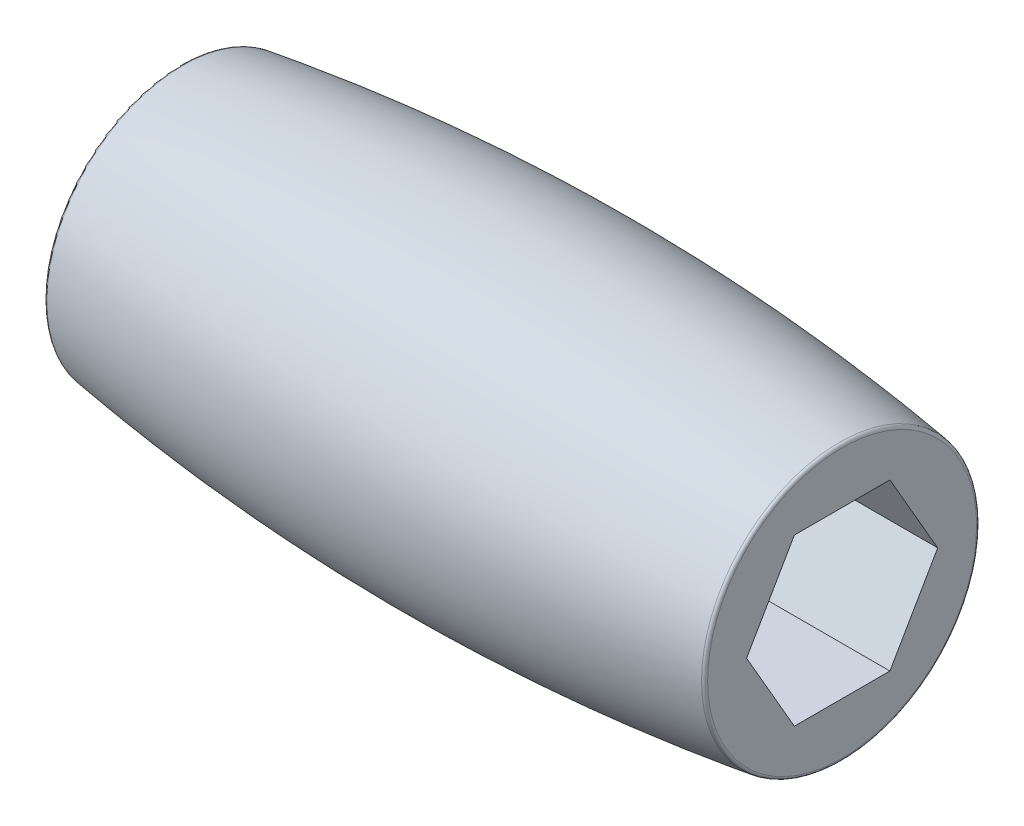
ISO-10303-21;
HEADER;
FILE_DESCRIPTION(('STEP AP214'),'2;1');
FILE_NAME('part.step','',(''),(''),'','','');
FILE_SCHEMA(('AUTOMOTIVE_DESIGN { 1 0 10303 214 1 1 1 1 }'));
ENDSEC;
DATA;
#1=APPLICATION_CONTEXT('core data for automotive mechanical design processes');
#2=APPLICATION_PROTOCOL_DEFINITION('international standard','automotive_design',2000,#1);
#3=PRODUCT_CONTEXT('',#1,'mechanical');
#4=PRODUCT('Part','Part','',(#3));
#5=PRODUCT_RELATED_PRODUCT_CATEGORY('part','',(#4));
#6=PRODUCT_DEFINITION_FORMATION('','',#4);
#7=PRODUCT_DEFINITION_CONTEXT('part definition',#1,'design');
#8=PRODUCT_DEFINITION('design','',#6,#7);
#9=PRODUCT_DEFINITION_SHAPE('','',#8);
#10=(LENGTH_UNIT() NAMED_UNIT(*) SI_UNIT(.MILLI.,.METRE.));
#11=(NAMED_UNIT(*) PLANE_ANGLE_UNIT() SI_UNIT($,.RADIAN.));
#12=(NAMED_UNIT(*) SI_UNIT($,.STERADIAN.) SOLID_ANGLE_UNIT());
#13=UNCERTAINTY_MEASURE_WITH_UNIT(LENGTH_MEASURE(1.E-05),#10,'distance_accuracy_value','');
#14=(GEOMETRIC_REPRESENTATION_CONTEXT(3) GLOBAL_UNCERTAINTY_ASSIGNED_CONTEXT((#13)) GLOBAL_UNIT_ASSIGNED_CONTEXT((#10,
#11,#12)) REPRESENTATION_CONTEXT('',''));
#15=CARTESIAN_POINT('',(0.,0.,0.));
#16=DIRECTION('',(0.,0.,1.));
#17=DIRECTION('',(1.,0.,0.));
#18=AXIS2_PLACEMENT_3D('',#15,#16,#17);
#19=CARTESIAN_POINT('',(25.4,95.631,3.66617420935412));
#20=DIRECTION('',(0.,1.,0.));
#21=DIRECTION('',(0.,0.,1.));
#22=AXIS2_PLACEMENT_3D('',#19,#20,#21);
#23=PLANE('',#22);
#24=DIRECTION('',(1.,0.,0.));
#25=VECTOR('',#24,1.);
#26=CARTESIAN_POINT('',(25.4,95.631,-3.66617420935411));
#27=LINE('',#26,#25);
#28=CARTESIAN_POINT('',(-25.4,95.631,-3.66617420935411));
#29=VERTEX_POINT('',#28);
#30=CARTESIAN_POINT('',(25.4,95.631,-3.66617420935411));
#31=VERTEX_POINT('',#30);
#32=EDGE_CURVE('E105',#29,#31,#27,.T.);
#33=ORIENTED_EDGE('',*,*,#32,.T.);
#34=DIRECTION('',(0.,0.,1.));
#35=VECTOR('',#34,1.);
#36=CARTESIAN_POINT('',(25.4,95.631,0.));
#37=LINE('',#36,#35);
#38=CARTESIAN_POINT('',(25.4,95.631,3.66617420935412));
#39=VERTEX_POINT('',#38);
#40=EDGE_CURVE('E119',#31,#39,#37,.T.);
#41=ORIENTED_EDGE('',*,*,#40,.T.);
#42=DIRECTION('',(1.,0.,0.));
#43=VECTOR('',#42,1.);
#44=CARTESIAN_POINT('',(25.4,95.631,3.66617420935412));
#45=LINE('',#44,#43);
#46=CARTESIAN_POINT('',(-25.4,95.631,3.66617420935412));
#47=VERTEX_POINT('',#46);
#48=EDGE_CURVE('E114',#39,#47,#45,.F.);
#49=ORIENTED_EDGE('',*,*,#48,.T.);
#50=DIRECTION('',(0.,0.,-1.));
#51=VECTOR('',#50,1.);
#52=CARTESIAN_POINT('',(-25.4,95.631,0.));
#53=LINE('',#52,#51);
#54=EDGE_CURVE('E183',#47,#29,#53,.T.);
#55=ORIENTED_EDGE('',*,*,#54,.T.);
#56=EDGE_LOOP('',(#33,#41,#49,#55));
#57=FACE_BOUND('',#56,.T.);
#58=ADVANCED_FACE('F18',(#57),#23,.F.);
#59=CARTESIAN_POINT('',(25.4,95.631,-3.66617420935411));
#60=DIRECTION('',(0.,0.5,-0.866025403784439));
#61=DIRECTION('',(0.,0.866025403784439,0.5));
#62=AXIS2_PLACEMENT_3D('',#59,#60,#61);
#63=PLANE('',#62);
#64=DIRECTION('',(1.,0.,0.));
#65=VECTOR('',#64,1.);
#66=CARTESIAN_POINT('',(25.4,89.281,-7.33234841870823));
#67=LINE('',#66,#65);
#68=CARTESIAN_POINT('',(-25.4,89.281,-7.33234841870823));
#69=VERTEX_POINT('',#68);
#70=CARTESIAN_POINT('',(25.4,89.281,-7.33234841870823));
#71=VERTEX_POINT('',#70);
#72=EDGE_CURVE('E93',#69,#71,#67,.T.);
#73=ORIENTED_EDGE('',*,*,#72,.T.);
#74=DIRECTION('',(0.,0.866025403784439,0.5));
#75=VECTOR('',#74,1.);
#76=CARTESIAN_POINT('',(25.4,89.281,-7.33234841870823));
#77=LINE('',#76,#75);
#78=EDGE_CURVE('E98',#71,#31,#77,.T.);
#79=ORIENTED_EDGE('',*,*,#78,.T.);
#80=ORIENTED_EDGE('',*,*,#32,.F.);
#81=DIRECTION('',(0.,-0.866025403784439,-0.5));
#82=VECTOR('',#81,1.);
#83=CARTESIAN_POINT('',(-25.4,95.631,-3.66617420935411));
#84=LINE('',#83,#82);
#85=EDGE_CURVE('E101',#29,#69,#84,.T.);
#86=ORIENTED_EDGE('',*,*,#85,.T.);
#87=EDGE_LOOP('',(#73,#79,#80,#86));
#88=FACE_BOUND('',#87,.T.);
#89=ADVANCED_FACE('F95',(#88),#63,.F.);
#90=CARTESIAN_POINT('',(25.4,89.281,-7.33234841870823));
#91=DIRECTION('',(0.,-0.5,-0.866025403784439));
#92=DIRECTION('',(0.,0.866025403784439,-0.5));
#93=AXIS2_PLACEMENT_3D('',#90,#91,#92);
#94=PLANE('',#93);
#95=DIRECTION('',(1.,0.,0.));
#96=VECTOR('',#95,1.);
#97=CARTESIAN_POINT('',(25.4,82.931,-3.66617420935411));
#98=LINE('',#97,#96);
#99=CARTESIAN_POINT('',(-25.4,82.931,-3.66617420935411));
#100=VERTEX_POINT('',#99);
#101=CARTESIAN_POINT('',(25.4,82.931,-3.66617420935411));
#102=VERTEX_POINT('',#101);
#103=EDGE_CURVE('E104',#100,#102,#98,.T.);
#104=ORIENTED_EDGE('',*,*,#103,.T.);
#105=DIRECTION('',(0.,0.866025403784439,-0.5));
#106=VECTOR('',#105,1.);
#107=CARTESIAN_POINT('',(25.4,82.931,-3.66617420935411));
#108=LINE('',#107,#106);
#109=EDGE_CURVE('E108',#102,#71,#108,.T.);
#110=ORIENTED_EDGE('',*,*,#109,.T.);
#111=ORIENTED_EDGE('',*,*,#72,.F.);
#112=DIRECTION('',(0.,-0.866025403784439,0.5));
#113=VECTOR('',#112,1.);
#114=CARTESIAN_POINT('',(-25.4,89.281,-7.33234841870823));
#115=LINE('',#114,#113);
#116=EDGE_CURVE('E180',#69,#100,#115,.T.);
#117=ORIENTED_EDGE('',*,*,#116,.T.);
#118=EDGE_LOOP('',(#104,#110,#111,#117));
#119=FACE_BOUND('',#118,.T.);
#120=ADVANCED_FACE('F109',(#119),#94,.F.);
#121=CARTESIAN_POINT('',(25.4,82.931,-3.66617420935411));
#122=DIRECTION('',(0.,-1.,0.));
#123=DIRECTION('',(0.,0.,-1.));
#124=AXIS2_PLACEMENT_3D('',#121,#122,#123);
#125=PLANE('',#124);
#126=DIRECTION('',(1.,0.,0.));
#127=VECTOR('',#126,1.);
#128=CARTESIAN_POINT('',(25.4,82.931,3.66617420935413));
#129=LINE('',#128,#127);
#130=CARTESIAN_POINT('',(-25.4,82.931,3.66617420935413));
#131=VERTEX_POINT('',#130);
#132=CARTESIAN_POINT('',(25.4,82.931,3.66617420935413));
#133=VERTEX_POINT('',#132);
#134=EDGE_CURVE('E228',#131,#133,#129,.T.);
#135=ORIENTED_EDGE('',*,*,#134,.T.);
#136=DIRECTION('',(0.,0.,1.));
#137=VECTOR('',#136,1.);
#138=CARTESIAN_POINT('',(25.4,82.931,0.));
#139=LINE('',#138,#137);
#140=EDGE_CURVE('E185',#133,#102,#139,.F.);
#141=ORIENTED_EDGE('',*,*,#140,.T.);
#142=ORIENTED_EDGE('',*,*,#103,.F.);
#143=DIRECTION('',(0.,0.,-1.));
#144=VECTOR('',#143,1.);
#145=CARTESIAN_POINT('',(-25.4,82.931,0.));
#146=LINE('',#145,#144);
#147=EDGE_CURVE('E178',#100,#131,#146,.F.);
#148=ORIENTED_EDGE('',*,*,#147,.T.);
#149=EDGE_LOOP('',(#135,#141,#142,#148));
#150=FACE_BOUND('',#149,.T.);
#151=ADVANCED_FACE('F283',(#150),#125,.F.);
#152=CARTESIAN_POINT('',(25.4,82.931,3.66617420935413));
#153=DIRECTION('',(0.,-0.5,0.866025403784439));
#154=DIRECTION('',(0.,-0.866025403784439,-0.5));
#155=AXIS2_PLACEMENT_3D('',#152,#153,#154);
#156=PLANE('',#155);
#157=DIRECTION('',(1.,0.,0.));
#158=VECTOR('',#157,1.);
#159=CARTESIAN_POINT('',(25.4,89.281,7.33234841870825));
#160=LINE('',#159,#158);
#161=CARTESIAN_POINT('',(-25.4,89.281,7.33234841870825));
#162=VERTEX_POINT('',#161);
#163=CARTESIAN_POINT('',(25.4,89.281,7.33234841870825));
#164=VERTEX_POINT('',#163);
#165=EDGE_CURVE('E225',#162,#164,#160,.T.);
#166=ORIENTED_EDGE('',*,*,#165,.T.);
#167=DIRECTION('',(0.,-0.866025403784439,-0.5));
#168=VECTOR('',#167,1.);
#169=CARTESIAN_POINT('',(25.4,89.281,7.33234841870825));
#170=LINE('',#169,#168);
#171=EDGE_CURVE('E220',#164,#133,#170,.T.);
#172=ORIENTED_EDGE('',*,*,#171,.T.);
#173=ORIENTED_EDGE('',*,*,#134,.F.);
#174=DIRECTION('',(0.,0.866025403784439,0.5));
#175=VECTOR('',#174,1.);
#176=CARTESIAN_POINT('',(-25.4,82.931,3.66617420935413));
#177=LINE('',#176,#175);
#178=EDGE_CURVE('E58',#131,#162,#177,.T.);
#179=ORIENTED_EDGE('',*,*,#178,.T.);
#180=EDGE_LOOP('',(#166,#172,#173,#179));
#181=FACE_BOUND('',#180,.T.);
#182=ADVANCED_FACE('F227',(#181),#156,.F.);
#183=CARTESIAN_POINT('',(25.4,89.281,7.33234841870825));
#184=DIRECTION('',(0.,0.500000000000001,0.866025403784438));
#185=DIRECTION('',(0.,-0.866025403784438,0.500000000000001));
#186=AXIS2_PLACEMENT_3D('',#183,#184,#185);
#187=PLANE('',#186);
#188=ORIENTED_EDGE('',*,*,#48,.F.);
#189=DIRECTION('',(0.,-0.866025403784439,0.5));
#190=VECTOR('',#189,1.);
#191=CARTESIAN_POINT('',(25.4,95.631,3.66617420935413));
#192=LINE('',#191,#190);
#193=EDGE_CURVE('E121',#39,#164,#192,.T.);
#194=ORIENTED_EDGE('',*,*,#193,.T.);
#195=ORIENTED_EDGE('',*,*,#165,.F.);
#196=DIRECTION('',(0.,0.866025403784438,-0.500000000000001));
#197=VECTOR('',#196,1.);
#198=CARTESIAN_POINT('',(-25.4,89.281,7.33234841870825));
#199=LINE('',#198,#197);
#200=EDGE_CURVE('E168',#162,#47,#199,.T.);
#201=ORIENTED_EDGE('',*,*,#200,.T.);
#202=EDGE_LOOP('',(#188,#194,#195,#201));
#203=FACE_BOUND('',#202,.T.);
#204=ADVANCED_FACE('F208',(#203),#187,.F.);
#205=CARTESIAN_POINT('',(25.4,99.822,0.));
#206=DIRECTION('',(-1.,0.,0.));
#207=DIRECTION('',(0.,0.,1.));
#208=AXIS2_PLACEMENT_3D('',#205,#206,#207);
#209=PLANE('',#208);
#210=CARTESIAN_POINT('',(25.4,89.281,0.));
#211=DIRECTION('',(-1.,0.,0.));
#212=DIRECTION('',(0.,0.,1.));
#213=AXIS2_PLACEMENT_3D('',#210,#211,#212);
#214=CIRCLE('',#213,10.3208893877998);
#215=CARTESIAN_POINT('',(25.4,89.281,10.3208893877998));
#216=VERTEX_POINT('',#215);
#217=CARTESIAN_POINT('',(25.4,89.281,-10.3208893877998));
#218=VERTEX_POINT('',#217);
#219=EDGE_CURVE('E48',#216,#218,#214,.T.);
#220=ORIENTED_EDGE('',*,*,#219,.F.);
#221=CARTESIAN_POINT('',(25.4,89.281,0.));
#222=DIRECTION('',(-1.,0.,0.));
#223=DIRECTION('',(0.,0.,-1.));
#224=AXIS2_PLACEMENT_3D('',#221,#222,#223);
#225=CIRCLE('',#224,10.3208893877998);
#226=EDGE_CURVE('E176',#218,#216,#225,.T.);
#227=ORIENTED_EDGE('',*,*,#226,.F.);
#228=EDGE_LOOP('',(#220,#227));
#229=FACE_BOUND('',#228,.T.);
#230=ORIENTED_EDGE('',*,*,#171,.F.);
#231=ORIENTED_EDGE('',*,*,#193,.F.);
#232=ORIENTED_EDGE('',*,*,#40,.F.);
#233=ORIENTED_EDGE('',*,*,#78,.F.);
#234=ORIENTED_EDGE('',*,*,#109,.F.);
#235=ORIENTED_EDGE('',*,*,#140,.F.);
#236=EDGE_LOOP('',(#230,#231,#232,#233,#234,#235));
#237=FACE_BOUND('',#236,.T.);
#238=ADVANCED_FACE('F117',(#229,#237),#209,.F.);
#239=CARTESIAN_POINT('',(-25.4,99.6886331180893,0.));
#240=DIRECTION('',(1.,0.,0.));
#241=DIRECTION('',(0.,0.,-1.));
#242=AXIS2_PLACEMENT_3D('',#239,#240,#241);
#243=PLANE('',#242);
#244=CARTESIAN_POINT('',(-25.4,89.281,0.));
#245=DIRECTION('',(1.,0.,0.));
#246=DIRECTION('',(0.,0.,-1.));
#247=AXIS2_PLACEMENT_3D('',#244,#245,#246);
#248=CIRCLE('',#247,10.1886881924399);
#249=CARTESIAN_POINT('',(-25.4,89.281,-10.1886881924399));
#250=VERTEX_POINT('',#249);
#251=CARTESIAN_POINT('',(-25.4,89.281,10.1886881924399));
#252=VERTEX_POINT('',#251);
#253=EDGE_CURVE('E156',#250,#252,#248,.T.);
#254=ORIENTED_EDGE('',*,*,#253,.F.);
#255=CARTESIAN_POINT('',(-25.4,89.281,0.));
#256=DIRECTION('',(1.,0.,0.));
#257=DIRECTION('',(0.,0.,1.));
#258=AXIS2_PLACEMENT_3D('',#255,#256,#257);
#259=CIRCLE('',#258,10.1886881924399);
#260=EDGE_CURVE('E37',#252,#250,#259,.T.);
#261=ORIENTED_EDGE('',*,*,#260,.F.);
#262=EDGE_LOOP('',(#254,#261));
#263=FACE_BOUND('',#262,.T.);
#264=ORIENTED_EDGE('',*,*,#178,.F.);
#265=ORIENTED_EDGE('',*,*,#147,.F.);
#266=ORIENTED_EDGE('',*,*,#116,.F.);
#267=ORIENTED_EDGE('',*,*,#85,.F.);
#268=ORIENTED_EDGE('',*,*,#54,.F.);
#269=ORIENTED_EDGE('',*,*,#200,.F.);
#270=EDGE_LOOP('',(#264,#265,#266,#267,#268,#269));
#271=FACE_BOUND('',#270,.T.);
#272=ADVANCED_FACE('F143',(#263,#271),#243,.F.);
#273=CARTESIAN_POINT('',(25.146,89.281,0.));
#274=DIRECTION('',(-1.,0.,0.));
#275=DIRECTION('',(0.,0.,1.));
#276=AXIS2_PLACEMENT_3D('',#273,#274,#275);
#277=TOROIDAL_SURFACE('',#276,10.3208893877998,0.254);
#278=CARTESIAN_POINT('',(25.1819685776714,89.281,0.));
#279=DIRECTION('',(-1.,0.,0.));
#280=DIRECTION('',(0.,0.,1.));
#281=AXIS2_PLACEMENT_3D('',#278,#279,#280);
#282=CIRCLE('',#281,10.5723297612889);
#283=CARTESIAN_POINT('',(25.1819685776714,89.281,10.5723297612889));
#284=VERTEX_POINT('',#283);
#285=EDGE_CURVE('E29',#284,#284,#282,.T.);
#286=ORIENTED_EDGE('',*,*,#285,.F.);
#287=EDGE_LOOP('',(#286));
#288=FACE_BOUND('',#287,.T.);
#289=ORIENTED_EDGE('',*,*,#219,.T.);
#290=ORIENTED_EDGE('',*,*,#226,.T.);
#291=EDGE_LOOP('',(#289,#290));
#292=FACE_BOUND('',#291,.T.);
#293=ADVANCED_FACE('F131',(#288,#292),#277,.T.);
#294=CARTESIAN_POINT('',(-25.146,89.281,0.));
#295=DIRECTION('',(1.,0.,0.));
#296=DIRECTION('',(0.,0.,-1.));
#297=AXIS2_PLACEMENT_3D('',#294,#295,#296);
#298=TOROIDAL_SURFACE('',#297,10.1886881924399,0.254);
#299=CARTESIAN_POINT('',(-25.183289980231,89.281,0.));
#300=DIRECTION('',(-1.,0.,0.));
#301=DIRECTION('',(0.,0.,1.));
#302=AXIS2_PLACEMENT_3D('',#299,#300,#301);
#303=CIRCLE('',#302,10.4399359931754);
#304=CARTESIAN_POINT('',(-25.183289980231,89.281,10.4399359931754));
#305=VERTEX_POINT('',#304);
#306=EDGE_CURVE('E11',#305,#305,#303,.F.);
#307=ORIENTED_EDGE('',*,*,#306,.F.);
#308=EDGE_LOOP('',(#307));
#309=FACE_BOUND('',#308,.T.);
#310=ORIENTED_EDGE('',*,*,#253,.T.);
#311=ORIENTED_EDGE('',*,*,#260,.T.);
#312=EDGE_LOOP('',(#310,#311));
#313=FACE_BOUND('',#312,.T.);
#314=ADVANCED_FACE('F142',(#309,#313),#298,.T.);
#315=CARTESIAN_POINT('',(0.453571428571413,89.281,-162.292927012409));
#316=DIRECTION('',(0.,1.,0.));
#317=DIRECTION('',(0.,0.,1.));
#318=AXIS2_PLACEMENT_3D('',#315,#316,#317);
#319=CIRCLE('',#318,174.625);
#320=TRIMMED_CURVE('',#319,(PARAMETER_VALUE(-0.37806756126844)),
(PARAMETER_VALUE(0.378067561268441)),.T.,.PARAMETER.);
#321=CARTESIAN_POINT('',(0.453571428571413,89.281,0.));
#322=DIRECTION('',(-1.,0.,0.));
#323=AXIS1_PLACEMENT('',#321,#322);
#324=SURFACE_OF_REVOLUTION('',#320,#323);
#325=ORIENTED_EDGE('',*,*,#306,.T.);
#326=EDGE_LOOP('',(#325));
#327=FACE_BOUND('',#326,.T.);
#328=ORIENTED_EDGE('',*,*,#285,.T.);
#329=EDGE_LOOP('',(#328));
#330=FACE_BOUND('',#329,.T.);
#331=ADVANCED_FACE('F246',(#327,#330),#324,.F.);
#332=CLOSED_SHELL('',(#58,#89,#120,#151,#182,#204,#238,#272,#293,#314,#331));
#333=MANIFOLD_SOLID_BREP('B1',#332);
#334=ADVANCED_BREP_SHAPE_REPRESENTATION('',(#18,#333),#14);
#335=SHAPE_DEFINITION_REPRESENTATION(#9,#334);
ENDSEC;
END-ISO-10303-21;
